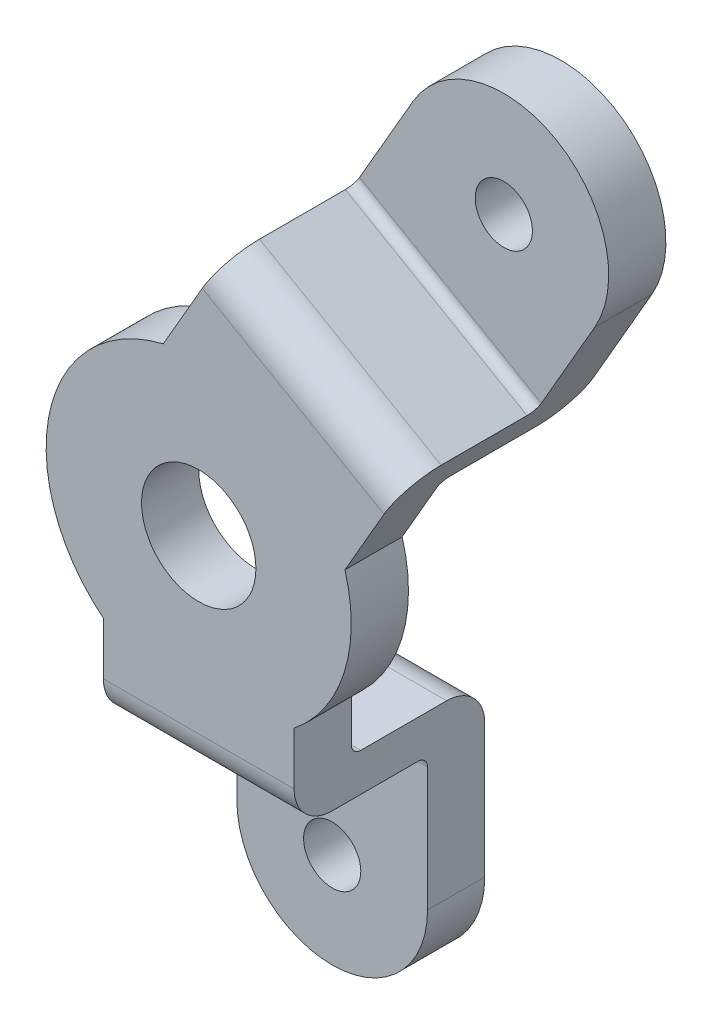
ISO-10303-21;
HEADER;
FILE_DESCRIPTION(('STEP AP214'),'2;1');
FILE_NAME('part.step','',(''),(''),'','','');
FILE_SCHEMA(('AUTOMOTIVE_DESIGN { 1 0 10303 214 1 1 1 1 }'));
ENDSEC;
DATA;
#1=APPLICATION_CONTEXT('core data for automotive mechanical design processes');
#2=APPLICATION_PROTOCOL_DEFINITION('international standard','automotive_design',2000,#1);
#3=PRODUCT_CONTEXT('',#1,'mechanical');
#4=PRODUCT('Part','Part','',(#3));
#5=PRODUCT_RELATED_PRODUCT_CATEGORY('part','',(#4));
#6=PRODUCT_DEFINITION_FORMATION('','',#4);
#7=PRODUCT_DEFINITION_CONTEXT('part definition',#1,'design');
#8=PRODUCT_DEFINITION('design','',#6,#7);
#9=PRODUCT_DEFINITION_SHAPE('','',#8);
#10=(LENGTH_UNIT() NAMED_UNIT(*) SI_UNIT(.MILLI.,.METRE.));
#11=(NAMED_UNIT(*) PLANE_ANGLE_UNIT() SI_UNIT($,.RADIAN.));
#12=(NAMED_UNIT(*) SI_UNIT($,.STERADIAN.) SOLID_ANGLE_UNIT());
#13=UNCERTAINTY_MEASURE_WITH_UNIT(LENGTH_MEASURE(1.E-05),#10,'distance_accuracy_value','');
#14=(GEOMETRIC_REPRESENTATION_CONTEXT(3) GLOBAL_UNCERTAINTY_ASSIGNED_CONTEXT((#13)) GLOBAL_UNIT_ASSIGNED_CONTEXT((#10,
#11,#12)) REPRESENTATION_CONTEXT('',''));
#15=CARTESIAN_POINT('',(0.,0.,0.));
#16=DIRECTION('',(0.,0.,1.));
#17=DIRECTION('',(1.,0.,0.));
#18=AXIS2_PLACEMENT_3D('',#15,#16,#17);
#19=CARTESIAN_POINT('',(17.9999999999998,31.1769145362399,0.));
#20=DIRECTION('',(0.,0.,1.));
#21=DIRECTION('',(1.,0.,0.));
#22=AXIS2_PLACEMENT_3D('',#19,#20,#21);
#23=PLANE('',#22);
#24=CARTESIAN_POINT('',(17.9999999999998,31.1769145362399,0.));
#25=DIRECTION('',(0.,0.,1.));
#26=DIRECTION('',(1.,0.,0.));
#27=AXIS2_PLACEMENT_3D('',#24,#25,#26);
#28=CIRCLE('',#27,3.);
#29=CARTESIAN_POINT('',(20.9999999999998,31.1769145362399,0.));
#30=VERTEX_POINT('',#29);
#31=EDGE_CURVE('E369',#30,#30,#28,.T.);
#32=ORIENTED_EDGE('',*,*,#31,.T.);
#33=EDGE_LOOP('',(#32));
#34=FACE_BOUND('',#33,.T.);
#35=DIRECTION('',(0.499999999999995,0.866025403784442,0.));
#36=VECTOR('',#35,1.);
#37=CARTESIAN_POINT('',(27.5262794416287,25.67691453624,0.));
#38=LINE('',#37,#36);
#39=CARTESIAN_POINT('',(21.4310169512842,15.1196102174944,0.));
#40=VERTEX_POINT('',#39);
#41=CARTESIAN_POINT('',(27.5262794416287,25.67691453624,0.));
#42=VERTEX_POINT('',#41);
#43=EDGE_CURVE('E388',#40,#42,#38,.T.);
#44=ORIENTED_EDGE('',*,*,#43,.F.);
#45=DIRECTION('',(0.866025403784439,-0.5,0.));
#46=VECTOR('',#45,1.);
#47=CARTESIAN_POINT('',(11.9047375096553,20.6196102174945,0.));
#48=LINE('',#47,#46);
#49=CARTESIAN_POINT('',(2.37845806802658,26.1196102174944,0.));
#50=VERTEX_POINT('',#49);
#51=EDGE_CURVE('E275',#40,#50,#48,.F.);
#52=ORIENTED_EDGE('',*,*,#51,.T.);
#53=DIRECTION('',(-0.499999999999995,-0.866025403784442,0.));
#54=VECTOR('',#53,1.);
#55=CARTESIAN_POINT('',(8.47372055837095,36.6769145362398,0.));
#56=LINE('',#55,#54);
#57=CARTESIAN_POINT('',(8.47372055837095,36.6769145362398,0.));
#58=VERTEX_POINT('',#57);
#59=EDGE_CURVE('E378',#58,#50,#56,.T.);
#60=ORIENTED_EDGE('',*,*,#59,.F.);
#61=CARTESIAN_POINT('',(17.9999999999998,31.1769145362399,0.));
#62=DIRECTION('',(0.,0.,1.));
#63=DIRECTION('',(1.,0.,0.));
#64=AXIS2_PLACEMENT_3D('',#61,#62,#63);
#65=CIRCLE('',#64,11.);
#66=EDGE_CURVE('E375',#42,#58,#65,.T.);
#67=ORIENTED_EDGE('',*,*,#66,.F.);
#68=EDGE_LOOP('',(#44,#52,#60,#67));
#69=FACE_BOUND('',#68,.T.);
#70=ADVANCED_FACE('F35',(#34,#69),#23,.F.);
#71=CARTESIAN_POINT('',(0.,0.,20.));
#72=DIRECTION('',(0.,0.,-1.));
#73=DIRECTION('',(-1.,0.,0.));
#74=AXIS2_PLACEMENT_3D('',#71,#72,#73);
#75=CYLINDRICAL_SURFACE('',#74,16.);
#76=CARTESIAN_POINT('',(0.,0.,14.));
#77=DIRECTION('',(0.,0.,-1.));
#78=DIRECTION('',(-1.,0.,0.));
#79=AXIS2_PLACEMENT_3D('',#76,#77,#78);
#80=CIRCLE('',#79,16.);
#81=CARTESIAN_POINT('',(-10.,-12.4899959967968,14.));
#82=VERTEX_POINT('',#81);
#83=CARTESIAN_POINT('',(-3.71680442231779,15.562305898749,14.));
#84=VERTEX_POINT('',#83);
#85=EDGE_CURVE('E423',#82,#84,#80,.T.);
#86=ORIENTED_EDGE('',*,*,#85,.F.);
#87=DIRECTION('',(0.,0.,-1.));
#88=VECTOR('',#87,1.);
#89=CARTESIAN_POINT('',(-10.,-12.4899959967968,20.));
#90=LINE('',#89,#88);
#91=CARTESIAN_POINT('',(-10.,-12.4899959967968,20.));
#92=VERTEX_POINT('',#91);
#93=EDGE_CURVE('E230',#92,#82,#90,.T.);
#94=ORIENTED_EDGE('',*,*,#93,.F.);
#95=CARTESIAN_POINT('',(0.,0.,20.));
#96=DIRECTION('',(0.,0.,1.));
#97=DIRECTION('',(1.,0.,0.));
#98=AXIS2_PLACEMENT_3D('',#95,#96,#97);
#99=CIRCLE('',#98,16.);
#100=CARTESIAN_POINT('',(-3.71680442231779,15.562305898749,20.));
#101=VERTEX_POINT('',#100);
#102=EDGE_CURVE('E392',#101,#92,#99,.T.);
#103=ORIENTED_EDGE('',*,*,#102,.F.);
#104=DIRECTION('',(0.,0.,-1.));
#105=VECTOR('',#104,1.);
#106=CARTESIAN_POINT('',(-3.71680442231779,15.562305898749,20.));
#107=LINE('',#106,#105);
#108=EDGE_CURVE('E233',#101,#84,#107,.T.);
#109=ORIENTED_EDGE('',*,*,#108,.T.);
#110=EDGE_LOOP('',(#86,#94,#103,#109));
#111=FACE_BOUND('',#110,.T.);
#112=ADVANCED_FACE('F422',(#111),#75,.T.);
#113=CARTESIAN_POINT('',(0.,0.,20.));
#114=DIRECTION('',(0.,0.,-1.));
#115=DIRECTION('',(-1.,0.,0.));
#116=AXIS2_PLACEMENT_3D('',#113,#114,#115);
#117=CYLINDRICAL_SURFACE('',#116,16.);
#118=CARTESIAN_POINT('',(0.,0.,14.));
#119=DIRECTION('',(0.,0.,-1.));
#120=DIRECTION('',(-1.,0.,0.));
#121=AXIS2_PLACEMENT_3D('',#118,#119,#120);
#122=CIRCLE('',#121,16.);
#123=CARTESIAN_POINT('',(15.3357544609399,4.56230589874916,14.));
#124=VERTEX_POINT('',#123);
#125=CARTESIAN_POINT('',(10.,-12.4899959967968,14.));
#126=VERTEX_POINT('',#125);
#127=EDGE_CURVE('E198',#124,#126,#122,.T.);
#128=ORIENTED_EDGE('',*,*,#127,.F.);
#129=DIRECTION('',(0.,0.,-1.));
#130=VECTOR('',#129,1.);
#131=CARTESIAN_POINT('',(15.3357544609399,4.56230589874916,20.));
#132=LINE('',#131,#130);
#133=CARTESIAN_POINT('',(15.3357544609399,4.56230589874916,20.));
#134=VERTEX_POINT('',#133);
#135=EDGE_CURVE('E209',#134,#124,#132,.T.);
#136=ORIENTED_EDGE('',*,*,#135,.F.);
#137=CARTESIAN_POINT('',(0.,0.,20.));
#138=DIRECTION('',(0.,0.,1.));
#139=DIRECTION('',(1.,0.,0.));
#140=AXIS2_PLACEMENT_3D('',#137,#138,#139);
#141=CIRCLE('',#140,16.);
#142=CARTESIAN_POINT('',(10.,-12.4899959967968,20.));
#143=VERTEX_POINT('',#142);
#144=EDGE_CURVE('E399',#143,#134,#141,.T.);
#145=ORIENTED_EDGE('',*,*,#144,.F.);
#146=DIRECTION('',(0.,0.,-1.));
#147=VECTOR('',#146,1.);
#148=CARTESIAN_POINT('',(10.,-12.4899959967968,20.));
#149=LINE('',#148,#147);
#150=EDGE_CURVE('E212',#143,#126,#149,.T.);
#151=ORIENTED_EDGE('',*,*,#150,.T.);
#152=EDGE_LOOP('',(#128,#136,#145,#151));
#153=FACE_BOUND('',#152,.T.);
#154=ADVANCED_FACE('F207',(#153),#117,.T.);
#155=CARTESIAN_POINT('',(0.,0.,20.));
#156=DIRECTION('',(0.,0.,-1.));
#157=DIRECTION('',(-1.,0.,0.));
#158=AXIS2_PLACEMENT_3D('',#155,#156,#157);
#159=CYLINDRICAL_SURFACE('',#158,6.);
#160=CARTESIAN_POINT('',(0.,0.,20.));
#161=DIRECTION('',(0.,0.,1.));
#162=DIRECTION('',(1.,0.,0.));
#163=AXIS2_PLACEMENT_3D('',#160,#161,#162);
#164=CIRCLE('',#163,6.);
#165=CARTESIAN_POINT('',(6.,0.,20.));
#166=VERTEX_POINT('',#165);
#167=EDGE_CURVE('E372',#166,#166,#164,.T.);
#168=ORIENTED_EDGE('',*,*,#167,.T.);
#169=EDGE_LOOP('',(#168));
#170=FACE_BOUND('',#169,.T.);
#171=CARTESIAN_POINT('',(0.,0.,14.));
#172=DIRECTION('',(0.,0.,-1.));
#173=DIRECTION('',(-1.,0.,0.));
#174=AXIS2_PLACEMENT_3D('',#171,#172,#173);
#175=CIRCLE('',#174,6.);
#176=CARTESIAN_POINT('',(-6.,0.,14.));
#177=VERTEX_POINT('',#176);
#178=EDGE_CURVE('E249',#177,#177,#175,.T.);
#179=ORIENTED_EDGE('',*,*,#178,.T.);
#180=EDGE_LOOP('',(#179));
#181=FACE_BOUND('',#180,.T.);
#182=ADVANCED_FACE('F496',(#170,#181),#159,.F.);
#183=CARTESIAN_POINT('',(0.,-36.,20.));
#184=DIRECTION('',(0.,0.,-1.));
#185=DIRECTION('',(-1.,0.,0.));
#186=AXIS2_PLACEMENT_3D('',#183,#184,#185);
#187=CYLINDRICAL_SURFACE('',#186,10.);
#188=CARTESIAN_POINT('',(0.,-36.,6.));
#189=DIRECTION('',(0.,0.,1.));
#190=DIRECTION('',(1.,0.,0.));
#191=AXIS2_PLACEMENT_3D('',#188,#189,#190);
#192=CIRCLE('',#191,10.);
#193=CARTESIAN_POINT('',(-10.,-36.,6.));
#194=VERTEX_POINT('',#193);
#195=CARTESIAN_POINT('',(10.,-36.,6.));
#196=VERTEX_POINT('',#195);
#197=EDGE_CURVE('E350',#194,#196,#192,.T.);
#198=ORIENTED_EDGE('',*,*,#197,.F.);
#199=DIRECTION('',(0.,0.,-1.));
#200=VECTOR('',#199,1.);
#201=CARTESIAN_POINT('',(-9.99999999999999,-36.,20.));
#202=LINE('',#201,#200);
#203=CARTESIAN_POINT('',(-9.99999999999999,-36.,0.));
#204=VERTEX_POINT('',#203);
#205=EDGE_CURVE('E227',#194,#204,#202,.T.);
#206=ORIENTED_EDGE('',*,*,#205,.T.);
#207=CARTESIAN_POINT('',(0.,-36.,0.));
#208=DIRECTION('',(0.,0.,1.));
#209=DIRECTION('',(1.,0.,0.));
#210=AXIS2_PLACEMENT_3D('',#207,#208,#209);
#211=CIRCLE('',#210,10.);
#212=CARTESIAN_POINT('',(10.,-36.,0.));
#213=VERTEX_POINT('',#212);
#214=EDGE_CURVE('E383',#204,#213,#211,.T.);
#215=ORIENTED_EDGE('',*,*,#214,.T.);
#216=DIRECTION('',(0.,0.,-1.));
#217=VECTOR('',#216,1.);
#218=CARTESIAN_POINT('',(10.,-36.,20.));
#219=LINE('',#218,#217);
#220=EDGE_CURVE('E220',#196,#213,#219,.T.);
#221=ORIENTED_EDGE('',*,*,#220,.F.);
#222=EDGE_LOOP('',(#198,#206,#215,#221));
#223=FACE_BOUND('',#222,.T.);
#224=ADVANCED_FACE('F448',(#223),#187,.T.);
#225=CARTESIAN_POINT('',(0.,-36.,20.));
#226=DIRECTION('',(0.,0.,-1.));
#227=DIRECTION('',(-1.,0.,0.));
#228=AXIS2_PLACEMENT_3D('',#225,#226,#227);
#229=CYLINDRICAL_SURFACE('',#228,3.);
#230=CARTESIAN_POINT('',(0.,-36.,0.));
#231=DIRECTION('',(0.,0.,1.));
#232=DIRECTION('',(1.,0.,0.));
#233=AXIS2_PLACEMENT_3D('',#230,#231,#232);
#234=CIRCLE('',#233,3.);
#235=CARTESIAN_POINT('',(3.00000000000001,-36.,0.));
#236=VERTEX_POINT('',#235);
#237=EDGE_CURVE('E242',#236,#236,#234,.T.);
#238=ORIENTED_EDGE('',*,*,#237,.F.);
#239=EDGE_LOOP('',(#238));
#240=FACE_BOUND('',#239,.T.);
#241=CARTESIAN_POINT('',(0.,-36.,6.));
#242=DIRECTION('',(0.,0.,1.));
#243=DIRECTION('',(1.,0.,0.));
#244=AXIS2_PLACEMENT_3D('',#241,#242,#243);
#245=CIRCLE('',#244,3.);
#246=CARTESIAN_POINT('',(3.00000000000001,-36.,6.));
#247=VERTEX_POINT('',#246);
#248=EDGE_CURVE('E244',#247,#247,#245,.T.);
#249=ORIENTED_EDGE('',*,*,#248,.T.);
#250=EDGE_LOOP('',(#249));
#251=FACE_BOUND('',#250,.T.);
#252=ADVANCED_FACE('F501',(#240,#251),#229,.F.);
#253=CARTESIAN_POINT('',(17.9999999999998,31.1769145362399,20.));
#254=DIRECTION('',(0.,0.,-1.));
#255=DIRECTION('',(-1.,0.,0.));
#256=AXIS2_PLACEMENT_3D('',#253,#254,#255);
#257=CYLINDRICAL_SURFACE('',#256,11.);
#258=CARTESIAN_POINT('',(17.9999999999998,31.1769145362399,6.));
#259=DIRECTION('',(0.,0.,1.));
#260=DIRECTION('',(1.,0.,0.));
#261=AXIS2_PLACEMENT_3D('',#258,#259,#260);
#262=CIRCLE('',#261,11.0000000000001);
#263=CARTESIAN_POINT('',(27.5262794416288,25.6769145362398,6.));
#264=VERTEX_POINT('',#263);
#265=CARTESIAN_POINT('',(8.47372055837089,36.6769145362399,6.));
#266=VERTEX_POINT('',#265);
#267=EDGE_CURVE('E362',#264,#266,#262,.T.);
#268=ORIENTED_EDGE('',*,*,#267,.F.);
#269=DIRECTION('',(0.,0.,-1.));
#270=VECTOR('',#269,1.);
#271=CARTESIAN_POINT('',(27.5262794416287,25.67691453624,20.));
#272=LINE('',#271,#270);
#273=EDGE_CURVE('E218',#264,#42,#272,.T.);
#274=ORIENTED_EDGE('',*,*,#273,.T.);
#275=ORIENTED_EDGE('',*,*,#66,.T.);
#276=DIRECTION('',(0.,0.,-1.));
#277=VECTOR('',#276,1.);
#278=CARTESIAN_POINT('',(8.47372055837095,36.6769145362398,20.));
#279=LINE('',#278,#277);
#280=EDGE_CURVE('E236',#266,#58,#279,.T.);
#281=ORIENTED_EDGE('',*,*,#280,.F.);
#282=EDGE_LOOP('',(#268,#274,#275,#281));
#283=FACE_BOUND('',#282,.T.);
#284=ADVANCED_FACE('F37',(#283),#257,.T.);
#285=CARTESIAN_POINT('',(17.9999999999998,31.1769145362399,20.));
#286=DIRECTION('',(0.,0.,-1.));
#287=DIRECTION('',(-1.,0.,0.));
#288=AXIS2_PLACEMENT_3D('',#285,#286,#287);
#289=CYLINDRICAL_SURFACE('',#288,3.);
#290=ORIENTED_EDGE('',*,*,#31,.F.);
#291=EDGE_LOOP('',(#290));
#292=FACE_BOUND('',#291,.T.);
#293=CARTESIAN_POINT('',(17.9999999999998,31.1769145362399,6.));
#294=DIRECTION('',(0.,0.,1.));
#295=DIRECTION('',(1.,0.,0.));
#296=AXIS2_PLACEMENT_3D('',#293,#294,#295);
#297=CIRCLE('',#296,3.);
#298=CARTESIAN_POINT('',(20.9999999999998,31.1769145362399,6.));
#299=VERTEX_POINT('',#298);
#300=EDGE_CURVE('E239',#299,#299,#297,.T.);
#301=ORIENTED_EDGE('',*,*,#300,.T.);
#302=EDGE_LOOP('',(#301));
#303=FACE_BOUND('',#302,.T.);
#304=ADVANCED_FACE('F484',(#292,#303),#289,.F.);
#305=CARTESIAN_POINT('',(17.9999999999998,31.1769145362399,20.));
#306=DIRECTION('',(0.,0.,1.));
#307=DIRECTION('',(1.,0.,0.));
#308=AXIS2_PLACEMENT_3D('',#305,#306,#307);
#309=PLANE('',#308);
#310=DIRECTION('',(0.,-1.,0.));
#311=VECTOR('',#310,1.);
#312=CARTESIAN_POINT('',(-9.99999999999999,-36.,20.));
#313=LINE('',#312,#311);
#314=CARTESIAN_POINT('',(-10.,-18.,20.));
#315=VERTEX_POINT('',#314);
#316=EDGE_CURVE('E394',#92,#315,#313,.T.);
#317=ORIENTED_EDGE('',*,*,#316,.T.);
#318=DIRECTION('',(-1.,0.,0.));
#319=VECTOR('',#318,1.);
#320=CARTESIAN_POINT('',(10.,-18.,20.));
#321=LINE('',#320,#319);
#322=CARTESIAN_POINT('',(10.,-18.,20.));
#323=VERTEX_POINT('',#322);
#324=EDGE_CURVE('E288',#315,#323,#321,.F.);
#325=ORIENTED_EDGE('',*,*,#324,.T.);
#326=DIRECTION('',(0.,1.,0.));
#327=VECTOR('',#326,1.);
#328=CARTESIAN_POINT('',(10.,-36.,20.));
#329=LINE('',#328,#327);
#330=EDGE_CURVE('E397',#323,#143,#329,.T.);
#331=ORIENTED_EDGE('',*,*,#330,.T.);
#332=ORIENTED_EDGE('',*,*,#144,.T.);
#333=DIRECTION('',(0.499999999999995,0.866025403784442,0.));
#334=VECTOR('',#333,1.);
#335=CARTESIAN_POINT('',(27.5262794416287,25.67691453624,20.));
#336=LINE('',#335,#334);
#337=CARTESIAN_POINT('',(19.4310169512842,11.6555086023567,20.));
#338=VERTEX_POINT('',#337);
#339=EDGE_CURVE('E217',#134,#338,#336,.T.);
#340=ORIENTED_EDGE('',*,*,#339,.T.);
#341=DIRECTION('',(0.866025403784439,-0.5,0.));
#342=VECTOR('',#341,1.);
#343=CARTESIAN_POINT('',(0.378458068026641,22.6555086023566,20.));
#344=LINE('',#343,#342);
#345=CARTESIAN_POINT('',(0.378458068026599,22.6555086023567,20.));
#346=VERTEX_POINT('',#345);
#347=EDGE_CURVE('E286',#338,#346,#344,.F.);
#348=ORIENTED_EDGE('',*,*,#347,.T.);
#349=DIRECTION('',(-0.499999999999995,-0.866025403784442,0.));
#350=VECTOR('',#349,1.);
#351=CARTESIAN_POINT('',(8.47372055837095,36.6769145362398,20.));
#352=LINE('',#351,#350);
#353=EDGE_CURVE('E390',#346,#101,#352,.T.);
#354=ORIENTED_EDGE('',*,*,#353,.T.);
#355=ORIENTED_EDGE('',*,*,#102,.T.);
#356=EDGE_LOOP('',(#317,#325,#331,#332,#340,#348,#354,#355));
#357=FACE_BOUND('',#356,.T.);
#358=ORIENTED_EDGE('',*,*,#167,.F.);
#359=EDGE_LOOP('',(#358));
#360=FACE_BOUND('',#359,.T.);
#361=ADVANCED_FACE('F402',(#357,#360),#309,.T.);
#362=DIRECTION('',(0.,-1.,0.));
#363=VECTOR('',#362,1.);
#364=CARTESIAN_POINT('',(-9.99999999999999,-36.,0.));
#365=LINE('',#364,#363);
#366=CARTESIAN_POINT('',(-10.,-22.,0.));
#367=VERTEX_POINT('',#366);
#368=EDGE_CURVE('E381',#367,#204,#365,.T.);
#369=ORIENTED_EDGE('',*,*,#368,.F.);
#370=DIRECTION('',(-1.,0.,0.));
#371=VECTOR('',#370,1.);
#372=CARTESIAN_POINT('',(17.9999999999998,-22.,0.));
#373=LINE('',#372,#371);
#374=CARTESIAN_POINT('',(10.,-22.,0.));
#375=VERTEX_POINT('',#374);
#376=EDGE_CURVE('E260',#367,#375,#373,.F.);
#377=ORIENTED_EDGE('',*,*,#376,.T.);
#378=DIRECTION('',(0.,1.,0.));
#379=VECTOR('',#378,1.);
#380=CARTESIAN_POINT('',(10.,-36.,0.));
#381=LINE('',#380,#379);
#382=EDGE_CURVE('E386',#213,#375,#381,.T.);
#383=ORIENTED_EDGE('',*,*,#382,.F.);
#384=ORIENTED_EDGE('',*,*,#214,.F.);
#385=EDGE_LOOP('',(#369,#377,#383,#384));
#386=FACE_BOUND('',#385,.T.);
#387=ORIENTED_EDGE('',*,*,#237,.T.);
#388=EDGE_LOOP('',(#387));
#389=FACE_BOUND('',#388,.T.);
#390=ADVANCED_FACE('F452',(#386,#389),#23,.F.);
#391=CARTESIAN_POINT('',(8.47372055837095,36.6769145362398,20.));
#392=DIRECTION('',(0.866025403784442,-0.499999999999995,0.));
#393=DIRECTION('',(0.499999999999995,0.866025403784442,0.));
#394=AXIS2_PLACEMENT_3D('',#391,#392,#393);
#395=PLANE('',#394);
#396=ORIENTED_EDGE('',*,*,#59,.T.);
#397=CARTESIAN_POINT('',(2.37845806802658,26.1196102174944,4.));
#398=DIRECTION('',(0.866025403784442,-0.499999999999995,0.));
#399=DIRECTION('',(0.499999999999995,0.866025403784442,0.));
#400=AXIS2_PLACEMENT_3D('',#397,#398,#399);
#401=CIRCLE('',#400,4.);
#402=CARTESIAN_POINT('',(0.378458068026602,22.6555086023567,4.));
#403=VERTEX_POINT('',#402);
#404=EDGE_CURVE('E280',#50,#403,#401,.F.);
#405=ORIENTED_EDGE('',*,*,#404,.T.);
#406=DIRECTION('',(0.,0.,-1.));
#407=VECTOR('',#406,1.);
#408=CARTESIAN_POINT('',(0.378458068026602,22.6555086023567,14.));
#409=LINE('',#408,#407);
#410=CARTESIAN_POINT('',(0.378458068026602,22.6555086023567,13.));
#411=VERTEX_POINT('',#410);
#412=EDGE_CURVE('E342',#411,#403,#409,.T.);
#413=ORIENTED_EDGE('',*,*,#412,.F.);
#414=CARTESIAN_POINT('',(-0.121541931973394,21.7894831985722,13.));
#415=DIRECTION('',(0.866025403784442,-0.499999999999995,0.));
#416=DIRECTION('',(0.499999999999995,0.866025403784442,0.));
#417=AXIS2_PLACEMENT_3D('',#414,#415,#416);
#418=CIRCLE('',#417,1.);
#419=CARTESIAN_POINT('',(-0.121541931973393,21.7894831985722,14.));
#420=VERTEX_POINT('',#419);
#421=EDGE_CURVE('E11',#411,#420,#418,.T.);
#422=ORIENTED_EDGE('',*,*,#421,.T.);
#423=DIRECTION('',(0.499999999999995,0.866025403784442,0.));
#424=VECTOR('',#423,1.);
#425=CARTESIAN_POINT('',(-3.71680442231779,15.562305898749,14.));
#426=LINE('',#425,#424);
#427=EDGE_CURVE('E345',#84,#420,#426,.T.);
#428=ORIENTED_EDGE('',*,*,#427,.F.);
#429=ORIENTED_EDGE('',*,*,#108,.F.);
#430=ORIENTED_EDGE('',*,*,#353,.F.);
#431=CARTESIAN_POINT('',(0.3784580680266,22.6555086023567,16.));
#432=DIRECTION('',(0.866025403784442,-0.499999999999995,0.));
#433=DIRECTION('',(0.499999999999995,0.866025403784442,0.));
#434=AXIS2_PLACEMENT_3D('',#431,#432,#433);
#435=CIRCLE('',#434,4.);
#436=CARTESIAN_POINT('',(2.37845806802664,26.1196102174944,16.));
#437=VERTEX_POINT('',#436);
#438=EDGE_CURVE('E277',#346,#437,#435,.F.);
#439=ORIENTED_EDGE('',*,*,#438,.T.);
#440=DIRECTION('',(0.,0.,1.));
#441=VECTOR('',#440,1.);
#442=CARTESIAN_POINT('',(2.37845806802664,26.1196102174944,6.));
#443=LINE('',#442,#441);
#444=CARTESIAN_POINT('',(2.37845806802664,26.1196102174944,7.));
#445=VERTEX_POINT('',#444);
#446=EDGE_CURVE('E364',#445,#437,#443,.T.);
#447=ORIENTED_EDGE('',*,*,#446,.F.);
#448=CARTESIAN_POINT('',(2.87845806802657,26.9856356212789,7.));
#449=DIRECTION('',(0.866025403784442,-0.499999999999995,0.));
#450=DIRECTION('',(0.499999999999995,0.866025403784442,0.));
#451=AXIS2_PLACEMENT_3D('',#448,#449,#450);
#452=CIRCLE('',#451,1.);
#453=CARTESIAN_POINT('',(2.87845806802663,26.9856356212788,6.));
#454=VERTEX_POINT('',#453);
#455=EDGE_CURVE('E309',#445,#454,#452,.T.);
#456=ORIENTED_EDGE('',*,*,#455,.T.);
#457=DIRECTION('',(-0.49999999999999,-0.866025403784445,0.));
#458=VECTOR('',#457,1.);
#459=CARTESIAN_POINT('',(2.37845806802664,26.1196102174944,6.));
#460=LINE('',#459,#458);
#461=EDGE_CURVE('E247',#266,#454,#460,.T.);
#462=ORIENTED_EDGE('',*,*,#461,.F.);
#463=ORIENTED_EDGE('',*,*,#280,.T.);
#464=EDGE_LOOP('',(#396,#405,#413,#422,#428,#429,#430,#439,#447,#456,#462,#463));
#465=FACE_BOUND('',#464,.T.);
#466=ADVANCED_FACE('F412',(#465),#395,.F.);
#467=CARTESIAN_POINT('',(-9.99999999999999,-36.,20.));
#468=DIRECTION('',(1.,0.,0.));
#469=DIRECTION('',(0.,1.,0.));
#470=AXIS2_PLACEMENT_3D('',#467,#468,#469);
#471=PLANE('',#470);
#472=DIRECTION('',(0.,1.,0.));
#473=VECTOR('',#472,1.);
#474=CARTESIAN_POINT('',(-10.,-18.,14.));
#475=LINE('',#474,#473);
#476=CARTESIAN_POINT('',(-10.,-17.,14.));
#477=VERTEX_POINT('',#476);
#478=EDGE_CURVE('E331',#477,#82,#475,.T.);
#479=ORIENTED_EDGE('',*,*,#478,.F.);
#480=CARTESIAN_POINT('',(-10.,-17.,13.));
#481=DIRECTION('',(1.,0.,0.));
#482=DIRECTION('',(0.,1.,0.));
#483=AXIS2_PLACEMENT_3D('',#480,#481,#482);
#484=CIRCLE('',#483,1.);
#485=CARTESIAN_POINT('',(-10.,-18.,13.));
#486=VERTEX_POINT('',#485);
#487=EDGE_CURVE('E316',#477,#486,#484,.T.);
#488=ORIENTED_EDGE('',*,*,#487,.T.);
#489=DIRECTION('',(0.,0.,-1.));
#490=VECTOR('',#489,1.);
#491=CARTESIAN_POINT('',(-10.,-18.,14.));
#492=LINE('',#491,#490);
#493=CARTESIAN_POINT('',(-10.,-18.,4.));
#494=VERTEX_POINT('',#493);
#495=EDGE_CURVE('E337',#486,#494,#492,.T.);
#496=ORIENTED_EDGE('',*,*,#495,.T.);
#497=CARTESIAN_POINT('',(-10.,-22.,4.));
#498=DIRECTION('',(1.,0.,0.));
#499=DIRECTION('',(0.,1.,0.));
#500=AXIS2_PLACEMENT_3D('',#497,#498,#499);
#501=CIRCLE('',#500,4.);
#502=EDGE_CURVE('E258',#494,#367,#501,.F.);
#503=ORIENTED_EDGE('',*,*,#502,.T.);
#504=ORIENTED_EDGE('',*,*,#368,.T.);
#505=ORIENTED_EDGE('',*,*,#205,.F.);
#506=DIRECTION('',(0.,-1.,0.));
#507=VECTOR('',#506,1.);
#508=CARTESIAN_POINT('',(-10.,-22.,6.));
#509=LINE('',#508,#507);
#510=CARTESIAN_POINT('',(-10.,-23.,6.));
#511=VERTEX_POINT('',#510);
#512=EDGE_CURVE('E252',#511,#194,#509,.T.);
#513=ORIENTED_EDGE('',*,*,#512,.F.);
#514=CARTESIAN_POINT('',(-10.,-23.,7.));
#515=DIRECTION('',(1.,0.,0.));
#516=DIRECTION('',(0.,1.,0.));
#517=AXIS2_PLACEMENT_3D('',#514,#515,#516);
#518=CIRCLE('',#517,1.);
#519=CARTESIAN_POINT('',(-10.,-22.,7.));
#520=VERTEX_POINT('',#519);
#521=EDGE_CURVE('E298',#511,#520,#518,.T.);
#522=ORIENTED_EDGE('',*,*,#521,.T.);
#523=DIRECTION('',(0.,0.,1.));
#524=VECTOR('',#523,1.);
#525=CARTESIAN_POINT('',(-10.,-22.,6.));
#526=LINE('',#525,#524);
#527=CARTESIAN_POINT('',(-10.,-22.,16.));
#528=VERTEX_POINT('',#527);
#529=EDGE_CURVE('E355',#520,#528,#526,.T.);
#530=ORIENTED_EDGE('',*,*,#529,.T.);
#531=CARTESIAN_POINT('',(-10.,-18.,16.));
#532=DIRECTION('',(1.,0.,0.));
#533=DIRECTION('',(0.,1.,0.));
#534=AXIS2_PLACEMENT_3D('',#531,#532,#533);
#535=CIRCLE('',#534,4.);
#536=EDGE_CURVE('E256',#528,#315,#535,.F.);
#537=ORIENTED_EDGE('',*,*,#536,.T.);
#538=ORIENTED_EDGE('',*,*,#316,.F.);
#539=ORIENTED_EDGE('',*,*,#93,.T.);
#540=EDGE_LOOP('',(#479,#488,#496,#503,#504,#505,#513,#522,#530,#537,#538,#539));
#541=FACE_BOUND('',#540,.T.);
#542=ADVANCED_FACE('F336',(#541),#471,.F.);
#543=CARTESIAN_POINT('',(10.,-36.,20.));
#544=DIRECTION('',(-1.,0.,0.));
#545=DIRECTION('',(0.,-1.,0.));
#546=AXIS2_PLACEMENT_3D('',#543,#544,#545);
#547=PLANE('',#546);
#548=ORIENTED_EDGE('',*,*,#382,.T.);
#549=CARTESIAN_POINT('',(10.,-22.,4.));
#550=DIRECTION('',(-1.,0.,0.));
#551=DIRECTION('',(0.,-1.,0.));
#552=AXIS2_PLACEMENT_3D('',#549,#550,#551);
#553=CIRCLE('',#552,4.);
#554=CARTESIAN_POINT('',(10.,-18.,4.));
#555=VERTEX_POINT('',#554);
#556=EDGE_CURVE('E265',#375,#555,#553,.F.);
#557=ORIENTED_EDGE('',*,*,#556,.T.);
#558=DIRECTION('',(0.,0.,-1.));
#559=VECTOR('',#558,1.);
#560=CARTESIAN_POINT('',(10.,-18.,14.));
#561=LINE('',#560,#559);
#562=CARTESIAN_POINT('',(10.,-18.,13.));
#563=VERTEX_POINT('',#562);
#564=EDGE_CURVE('E326',#563,#555,#561,.T.);
#565=ORIENTED_EDGE('',*,*,#564,.F.);
#566=CARTESIAN_POINT('',(10.,-17.,13.));
#567=DIRECTION('',(-1.,0.,0.));
#568=DIRECTION('',(0.,-1.,0.));
#569=AXIS2_PLACEMENT_3D('',#566,#567,#568);
#570=CIRCLE('',#569,1.);
#571=CARTESIAN_POINT('',(10.,-17.,14.));
#572=VERTEX_POINT('',#571);
#573=EDGE_CURVE('E318',#563,#572,#570,.T.);
#574=ORIENTED_EDGE('',*,*,#573,.T.);
#575=DIRECTION('',(0.,-1.,0.));
#576=VECTOR('',#575,1.);
#577=CARTESIAN_POINT('',(10.,-12.4899959967968,14.));
#578=LINE('',#577,#576);
#579=EDGE_CURVE('E213',#126,#572,#578,.T.);
#580=ORIENTED_EDGE('',*,*,#579,.F.);
#581=ORIENTED_EDGE('',*,*,#150,.F.);
#582=ORIENTED_EDGE('',*,*,#330,.F.);
#583=CARTESIAN_POINT('',(10.,-18.,16.));
#584=DIRECTION('',(-1.,0.,0.));
#585=DIRECTION('',(0.,-1.,0.));
#586=AXIS2_PLACEMENT_3D('',#583,#584,#585);
#587=CIRCLE('',#586,4.);
#588=CARTESIAN_POINT('',(10.,-22.,16.));
#589=VERTEX_POINT('',#588);
#590=EDGE_CURVE('E262',#323,#589,#587,.F.);
#591=ORIENTED_EDGE('',*,*,#590,.T.);
#592=DIRECTION('',(0.,0.,1.));
#593=VECTOR('',#592,1.);
#594=CARTESIAN_POINT('',(10.,-22.,6.));
#595=LINE('',#594,#593);
#596=CARTESIAN_POINT('',(10.,-22.,7.));
#597=VERTEX_POINT('',#596);
#598=EDGE_CURVE('E248',#597,#589,#595,.T.);
#599=ORIENTED_EDGE('',*,*,#598,.F.);
#600=CARTESIAN_POINT('',(10.,-23.,7.));
#601=DIRECTION('',(-1.,0.,0.));
#602=DIRECTION('',(0.,-1.,0.));
#603=AXIS2_PLACEMENT_3D('',#600,#601,#602);
#604=CIRCLE('',#603,1.);
#605=CARTESIAN_POINT('',(10.,-23.,6.));
#606=VERTEX_POINT('',#605);
#607=EDGE_CURVE('E300',#597,#606,#604,.T.);
#608=ORIENTED_EDGE('',*,*,#607,.T.);
#609=DIRECTION('',(0.,1.,0.));
#610=VECTOR('',#609,1.);
#611=CARTESIAN_POINT('',(10.,-22.,6.));
#612=LINE('',#611,#610);
#613=EDGE_CURVE('E352',#196,#606,#612,.T.);
#614=ORIENTED_EDGE('',*,*,#613,.F.);
#615=ORIENTED_EDGE('',*,*,#220,.T.);
#616=EDGE_LOOP('',(#548,#557,#565,#574,#580,#581,#582,#591,#599,#608,#614,#615));
#617=FACE_BOUND('',#616,.T.);
#618=ADVANCED_FACE('F325',(#617),#547,.F.);
#619=CARTESIAN_POINT('',(27.5262794416287,25.67691453624,20.));
#620=DIRECTION('',(-0.866025403784442,0.499999999999995,0.));
#621=DIRECTION('',(-0.499999999999995,-0.866025403784442,0.));
#622=AXIS2_PLACEMENT_3D('',#619,#620,#621);
#623=PLANE('',#622);
#624=DIRECTION('',(-0.499999999999984,-0.866025403784448,0.));
#625=VECTOR('',#624,1.);
#626=CARTESIAN_POINT('',(19.4310169512841,11.6555086023567,14.));
#627=LINE('',#626,#625);
#628=CARTESIAN_POINT('',(18.9310169512842,10.7894831985723,14.));
#629=VERTEX_POINT('',#628);
#630=EDGE_CURVE('E193',#629,#124,#627,.T.);
#631=ORIENTED_EDGE('',*,*,#630,.F.);
#632=CARTESIAN_POINT('',(18.9310169512842,10.7894831985722,13.));
#633=DIRECTION('',(-0.866025403784442,0.499999999999995,0.));
#634=DIRECTION('',(-0.499999999999995,-0.866025403784442,0.));
#635=AXIS2_PLACEMENT_3D('',#632,#633,#634);
#636=CIRCLE('',#635,1.);
#637=CARTESIAN_POINT('',(19.4310169512841,11.6555086023567,13.));
#638=VERTEX_POINT('',#637);
#639=EDGE_CURVE('E43',#629,#638,#636,.T.);
#640=ORIENTED_EDGE('',*,*,#639,.T.);
#641=DIRECTION('',(0.,0.,-1.));
#642=VECTOR('',#641,1.);
#643=CARTESIAN_POINT('',(19.4310169512841,11.6555086023567,14.));
#644=LINE('',#643,#642);
#645=CARTESIAN_POINT('',(19.4310169512841,11.6555086023567,4.));
#646=VERTEX_POINT('',#645);
#647=EDGE_CURVE('E253',#638,#646,#644,.T.);
#648=ORIENTED_EDGE('',*,*,#647,.T.);
#649=CARTESIAN_POINT('',(21.4310169512842,15.1196102174944,4.));
#650=DIRECTION('',(-0.866025403784442,0.499999999999995,0.));
#651=DIRECTION('',(-0.499999999999995,-0.866025403784442,0.));
#652=AXIS2_PLACEMENT_3D('',#649,#650,#651);
#653=CIRCLE('',#652,4.);
#654=EDGE_CURVE('E273',#646,#40,#653,.F.);
#655=ORIENTED_EDGE('',*,*,#654,.T.);
#656=ORIENTED_EDGE('',*,*,#43,.T.);
#657=ORIENTED_EDGE('',*,*,#273,.F.);
#658=DIRECTION('',(0.5,0.866025403784439,0.));
#659=VECTOR('',#658,1.);
#660=CARTESIAN_POINT('',(21.4310169512843,15.1196102174944,6.));
#661=LINE('',#660,#659);
#662=CARTESIAN_POINT('',(21.9310169512843,15.9856356212788,6.));
#663=VERTEX_POINT('',#662);
#664=EDGE_CURVE('E360',#663,#264,#661,.T.);
#665=ORIENTED_EDGE('',*,*,#664,.F.);
#666=CARTESIAN_POINT('',(21.9310169512842,15.9856356212789,7.));
#667=DIRECTION('',(-0.866025403784442,0.499999999999995,0.));
#668=DIRECTION('',(-0.499999999999995,-0.866025403784442,0.));
#669=AXIS2_PLACEMENT_3D('',#666,#667,#668);
#670=CIRCLE('',#669,1.);
#671=CARTESIAN_POINT('',(21.4310169512843,15.1196102174944,7.));
#672=VERTEX_POINT('',#671);
#673=EDGE_CURVE('E307',#663,#672,#670,.T.);
#674=ORIENTED_EDGE('',*,*,#673,.T.);
#675=DIRECTION('',(0.,0.,1.));
#676=VECTOR('',#675,1.);
#677=CARTESIAN_POINT('',(21.4310169512843,15.1196102174944,6.));
#678=LINE('',#677,#676);
#679=CARTESIAN_POINT('',(21.4310169512843,15.1196102174944,16.));
#680=VERTEX_POINT('',#679);
#681=EDGE_CURVE('E243',#672,#680,#678,.T.);
#682=ORIENTED_EDGE('',*,*,#681,.T.);
#683=CARTESIAN_POINT('',(19.4310169512842,11.6555086023567,16.));
#684=DIRECTION('',(-0.866025403784442,0.499999999999995,0.));
#685=DIRECTION('',(-0.499999999999995,-0.866025403784442,0.));
#686=AXIS2_PLACEMENT_3D('',#683,#684,#685);
#687=CIRCLE('',#686,4.);
#688=EDGE_CURVE('E271',#680,#338,#687,.F.);
#689=ORIENTED_EDGE('',*,*,#688,.T.);
#690=ORIENTED_EDGE('',*,*,#339,.F.);
#691=ORIENTED_EDGE('',*,*,#135,.T.);
#692=EDGE_LOOP('',(#631,#640,#648,#655,#656,#657,#665,#674,#682,#689,#690,#691));
#693=FACE_BOUND('',#692,.T.);
#694=ADVANCED_FACE('F215',(#693),#623,.F.);
#695=CARTESIAN_POINT('',(2.37845806802664,26.1196102174944,6.));
#696=DIRECTION('',(-0.5,-0.866025403784439,0.));
#697=DIRECTION('',(0.866025403784439,-0.5,0.));
#698=AXIS2_PLACEMENT_3D('',#695,#696,#697);
#699=PLANE('',#698);
#700=ORIENTED_EDGE('',*,*,#681,.F.);
#701=DIRECTION('',(0.866025403784439,-0.5,0.));
#702=VECTOR('',#701,1.);
#703=CARTESIAN_POINT('',(2.37845806802664,26.1196102174944,7.));
#704=LINE('',#703,#702);
#705=EDGE_CURVE('E305',#672,#445,#704,.F.);
#706=ORIENTED_EDGE('',*,*,#705,.T.);
#707=ORIENTED_EDGE('',*,*,#446,.T.);
#708=DIRECTION('',(0.866025403784439,-0.5,0.));
#709=VECTOR('',#708,1.);
#710=CARTESIAN_POINT('',(21.4310169512843,15.1196102174944,16.));
#711=LINE('',#710,#709);
#712=EDGE_CURVE('E290',#437,#680,#711,.T.);
#713=ORIENTED_EDGE('',*,*,#712,.T.);
#714=EDGE_LOOP('',(#700,#706,#707,#713));
#715=FACE_BOUND('',#714,.T.);
#716=ADVANCED_FACE('F493',(#715),#699,.F.);
#717=CARTESIAN_POINT('',(17.9999999999998,31.1769145362399,6.));
#718=DIRECTION('',(0.,0.,1.));
#719=DIRECTION('',(1.,0.,0.));
#720=AXIS2_PLACEMENT_3D('',#717,#718,#719);
#721=PLANE('',#720);
#722=ORIENTED_EDGE('',*,*,#300,.F.);
#723=EDGE_LOOP('',(#722));
#724=FACE_BOUND('',#723,.T.);
#725=ORIENTED_EDGE('',*,*,#461,.T.);
#726=DIRECTION('',(0.866025403784439,-0.5,0.));
#727=VECTOR('',#726,1.);
#728=CARTESIAN_POINT('',(12.4047375096553,21.4856356212789,6.));
#729=LINE('',#728,#727);
#730=EDGE_CURVE('E302',#454,#663,#729,.T.);
#731=ORIENTED_EDGE('',*,*,#730,.T.);
#732=ORIENTED_EDGE('',*,*,#664,.T.);
#733=ORIENTED_EDGE('',*,*,#267,.T.);
#734=EDGE_LOOP('',(#725,#731,#732,#733));
#735=FACE_BOUND('',#734,.T.);
#736=ADVANCED_FACE('F521',(#724,#735),#721,.T.);
#737=CARTESIAN_POINT('',(-10.,-22.,6.));
#738=DIRECTION('',(0.,1.,0.));
#739=DIRECTION('',(0.,0.,1.));
#740=AXIS2_PLACEMENT_3D('',#737,#738,#739);
#741=PLANE('',#740);
#742=ORIENTED_EDGE('',*,*,#529,.F.);
#743=DIRECTION('',(-1.,0.,0.));
#744=VECTOR('',#743,1.);
#745=CARTESIAN_POINT('',(-10.,-22.,7.));
#746=LINE('',#745,#744);
#747=EDGE_CURVE('E296',#520,#597,#746,.F.);
#748=ORIENTED_EDGE('',*,*,#747,.T.);
#749=ORIENTED_EDGE('',*,*,#598,.T.);
#750=DIRECTION('',(-1.,0.,0.));
#751=VECTOR('',#750,1.);
#752=CARTESIAN_POINT('',(-10.,-22.,16.));
#753=LINE('',#752,#751);
#754=EDGE_CURVE('E283',#589,#528,#753,.T.);
#755=ORIENTED_EDGE('',*,*,#754,.T.);
#756=EDGE_LOOP('',(#742,#748,#749,#755));
#757=FACE_BOUND('',#756,.T.);
#758=ADVANCED_FACE('F431',(#757),#741,.F.);
#759=CARTESIAN_POINT('',(0.,-36.,6.));
#760=DIRECTION('',(0.,0.,1.));
#761=DIRECTION('',(1.,0.,0.));
#762=AXIS2_PLACEMENT_3D('',#759,#760,#761);
#763=PLANE('',#762);
#764=ORIENTED_EDGE('',*,*,#248,.F.);
#765=EDGE_LOOP('',(#764));
#766=FACE_BOUND('',#765,.T.);
#767=ORIENTED_EDGE('',*,*,#613,.T.);
#768=DIRECTION('',(-1.,0.,0.));
#769=VECTOR('',#768,1.);
#770=CARTESIAN_POINT('',(0.,-23.,6.));
#771=LINE('',#770,#769);
#772=EDGE_CURVE('E293',#606,#511,#771,.T.);
#773=ORIENTED_EDGE('',*,*,#772,.T.);
#774=ORIENTED_EDGE('',*,*,#512,.T.);
#775=ORIENTED_EDGE('',*,*,#197,.T.);
#776=EDGE_LOOP('',(#767,#773,#774,#775));
#777=FACE_BOUND('',#776,.T.);
#778=ADVANCED_FACE('F442',(#766,#777),#763,.T.);
#779=CARTESIAN_POINT('',(19.4310169512841,11.6555086023567,14.));
#780=DIRECTION('',(0.5,0.866025403784439,0.));
#781=DIRECTION('',(-0.866025403784439,0.5,0.));
#782=AXIS2_PLACEMENT_3D('',#779,#780,#781);
#783=PLANE('',#782);
#784=ORIENTED_EDGE('',*,*,#647,.F.);
#785=DIRECTION('',(0.866025403784439,-0.5,0.));
#786=VECTOR('',#785,1.);
#787=CARTESIAN_POINT('',(19.4310169512841,11.6555086023567,13.));
#788=LINE('',#787,#786);
#789=EDGE_CURVE('E56',#638,#411,#788,.F.);
#790=ORIENTED_EDGE('',*,*,#789,.T.);
#791=ORIENTED_EDGE('',*,*,#412,.T.);
#792=DIRECTION('',(0.866025403784439,-0.5,0.));
#793=VECTOR('',#792,1.);
#794=CARTESIAN_POINT('',(19.4310169512841,11.6555086023567,4.));
#795=LINE('',#794,#793);
#796=EDGE_CURVE('E268',#403,#646,#795,.T.);
#797=ORIENTED_EDGE('',*,*,#796,.T.);
#798=EDGE_LOOP('',(#784,#790,#791,#797));
#799=FACE_BOUND('',#798,.T.);
#800=ADVANCED_FACE('F542',(#799),#783,.F.);
#801=CARTESIAN_POINT('',(10.,-18.,14.));
#802=DIRECTION('',(0.,-1.,0.));
#803=DIRECTION('',(0.,0.,-1.));
#804=AXIS2_PLACEMENT_3D('',#801,#802,#803);
#805=PLANE('',#804);
#806=ORIENTED_EDGE('',*,*,#495,.F.);
#807=DIRECTION('',(-1.,0.,0.));
#808=VECTOR('',#807,1.);
#809=CARTESIAN_POINT('',(10.,-18.,13.));
#810=LINE('',#809,#808);
#811=EDGE_CURVE('E314',#486,#563,#810,.F.);
#812=ORIENTED_EDGE('',*,*,#811,.T.);
#813=ORIENTED_EDGE('',*,*,#564,.T.);
#814=DIRECTION('',(-1.,0.,0.));
#815=VECTOR('',#814,1.);
#816=CARTESIAN_POINT('',(10.,-18.,4.));
#817=LINE('',#816,#815);
#818=EDGE_CURVE('E238',#555,#494,#817,.T.);
#819=ORIENTED_EDGE('',*,*,#818,.T.);
#820=EDGE_LOOP('',(#806,#812,#813,#819));
#821=FACE_BOUND('',#820,.T.);
#822=ADVANCED_FACE('F340',(#821),#805,.F.);
#823=CARTESIAN_POINT('',(0.,0.,14.));
#824=DIRECTION('',(0.,0.,-1.));
#825=DIRECTION('',(-1.,0.,0.));
#826=AXIS2_PLACEMENT_3D('',#823,#824,#825);
#827=PLANE('',#826);
#828=ORIENTED_EDGE('',*,*,#178,.F.);
#829=EDGE_LOOP('',(#828));
#830=FACE_BOUND('',#829,.T.);
#831=ORIENTED_EDGE('',*,*,#427,.T.);
#832=DIRECTION('',(0.866025403784439,-0.5,0.));
#833=VECTOR('',#832,1.);
#834=CARTESIAN_POINT('',(9.40473750965553,16.2894831985722,14.));
#835=LINE('',#834,#833);
#836=EDGE_CURVE('E201',#420,#629,#835,.T.);
#837=ORIENTED_EDGE('',*,*,#836,.T.);
#838=ORIENTED_EDGE('',*,*,#630,.T.);
#839=ORIENTED_EDGE('',*,*,#127,.T.);
#840=ORIENTED_EDGE('',*,*,#579,.T.);
#841=DIRECTION('',(-1.,0.,0.));
#842=VECTOR('',#841,1.);
#843=CARTESIAN_POINT('',(0.,-17.,14.));
#844=LINE('',#843,#842);
#845=EDGE_CURVE('E311',#572,#477,#844,.T.);
#846=ORIENTED_EDGE('',*,*,#845,.T.);
#847=ORIENTED_EDGE('',*,*,#478,.T.);
#848=ORIENTED_EDGE('',*,*,#85,.T.);
#849=EDGE_LOOP('',(#831,#837,#838,#839,#840,#846,#847,#848));
#850=FACE_BOUND('',#849,.T.);
#851=ADVANCED_FACE('F196',(#830,#850),#827,.T.);
#852=CARTESIAN_POINT('',(10.,-22.,4.));
#853=DIRECTION('',(-1.,0.,0.));
#854=DIRECTION('',(0.,0.,1.));
#855=AXIS2_PLACEMENT_3D('',#852,#853,#854);
#856=CYLINDRICAL_SURFACE('',#855,4.);
#857=ORIENTED_EDGE('',*,*,#556,.F.);
#858=ORIENTED_EDGE('',*,*,#376,.F.);
#859=ORIENTED_EDGE('',*,*,#502,.F.);
#860=ORIENTED_EDGE('',*,*,#818,.F.);
#861=EDGE_LOOP('',(#857,#858,#859,#860));
#862=FACE_BOUND('',#861,.T.);
#863=ADVANCED_FACE('F457',(#862),#856,.T.);
#864=CARTESIAN_POINT('',(21.4310169512842,15.1196102174945,4.));
#865=DIRECTION('',(0.866025403784439,-0.5,0.));
#866=DIRECTION('',(0.5,0.866025403784439,0.));
#867=AXIS2_PLACEMENT_3D('',#864,#865,#866);
#868=CYLINDRICAL_SURFACE('',#867,4.);
#869=ORIENTED_EDGE('',*,*,#404,.F.);
#870=ORIENTED_EDGE('',*,*,#51,.F.);
#871=ORIENTED_EDGE('',*,*,#654,.F.);
#872=ORIENTED_EDGE('',*,*,#796,.F.);
#873=EDGE_LOOP('',(#869,#870,#871,#872));
#874=FACE_BOUND('',#873,.T.);
#875=ADVANCED_FACE('F459',(#874),#868,.T.);
#876=CARTESIAN_POINT('',(-10.,-18.,16.));
#877=DIRECTION('',(1.,0.,0.));
#878=DIRECTION('',(0.,0.,-1.));
#879=AXIS2_PLACEMENT_3D('',#876,#877,#878);
#880=CYLINDRICAL_SURFACE('',#879,4.);
#881=ORIENTED_EDGE('',*,*,#590,.F.);
#882=ORIENTED_EDGE('',*,*,#324,.F.);
#883=ORIENTED_EDGE('',*,*,#536,.F.);
#884=ORIENTED_EDGE('',*,*,#754,.F.);
#885=EDGE_LOOP('',(#881,#882,#883,#884));
#886=FACE_BOUND('',#885,.T.);
#887=ADVANCED_FACE('F429',(#886),#880,.T.);
#888=CARTESIAN_POINT('',(0.378458068026641,22.6555086023566,16.));
#889=DIRECTION('',(-0.866025403784439,0.5,0.));
#890=DIRECTION('',(-0.5,-0.866025403784439,0.));
#891=AXIS2_PLACEMENT_3D('',#888,#889,#890);
#892=CYLINDRICAL_SURFACE('',#891,4.);
#893=ORIENTED_EDGE('',*,*,#438,.F.);
#894=ORIENTED_EDGE('',*,*,#347,.F.);
#895=ORIENTED_EDGE('',*,*,#688,.F.);
#896=ORIENTED_EDGE('',*,*,#712,.F.);
#897=EDGE_LOOP('',(#893,#894,#895,#896));
#898=FACE_BOUND('',#897,.T.);
#899=ADVANCED_FACE('F408',(#898),#892,.T.);
#900=CARTESIAN_POINT('',(0.,-23.,7.));
#901=DIRECTION('',(-1.,0.,0.));
#902=DIRECTION('',(0.,0.,1.));
#903=AXIS2_PLACEMENT_3D('',#900,#901,#902);
#904=CYLINDRICAL_SURFACE('',#903,1.);
#905=ORIENTED_EDGE('',*,*,#607,.F.);
#906=ORIENTED_EDGE('',*,*,#747,.F.);
#907=ORIENTED_EDGE('',*,*,#521,.F.);
#908=ORIENTED_EDGE('',*,*,#772,.F.);
#909=EDGE_LOOP('',(#905,#906,#907,#908));
#910=FACE_BOUND('',#909,.T.);
#911=ADVANCED_FACE('F439',(#910),#904,.F.);
#912=CARTESIAN_POINT('',(12.4047375096553,21.4856356212789,7.));
#913=DIRECTION('',(0.866025403784439,-0.5,0.));
#914=DIRECTION('',(0.5,0.866025403784439,0.));
#915=AXIS2_PLACEMENT_3D('',#912,#913,#914);
#916=CYLINDRICAL_SURFACE('',#915,1.);
#917=ORIENTED_EDGE('',*,*,#455,.F.);
#918=ORIENTED_EDGE('',*,*,#705,.F.);
#919=ORIENTED_EDGE('',*,*,#673,.F.);
#920=ORIENTED_EDGE('',*,*,#730,.F.);
#921=EDGE_LOOP('',(#917,#918,#919,#920));
#922=FACE_BOUND('',#921,.T.);
#923=ADVANCED_FACE('F595',(#922),#916,.F.);
#924=CARTESIAN_POINT('',(0.,-17.,13.));
#925=DIRECTION('',(-1.,0.,0.));
#926=DIRECTION('',(0.,0.,1.));
#927=AXIS2_PLACEMENT_3D('',#924,#925,#926);
#928=CYLINDRICAL_SURFACE('',#927,1.);
#929=ORIENTED_EDGE('',*,*,#573,.F.);
#930=ORIENTED_EDGE('',*,*,#811,.F.);
#931=ORIENTED_EDGE('',*,*,#487,.F.);
#932=ORIENTED_EDGE('',*,*,#845,.F.);
#933=EDGE_LOOP('',(#929,#930,#931,#932));
#934=FACE_BOUND('',#933,.T.);
#935=ADVANCED_FACE('F333',(#934),#928,.F.);
#936=CARTESIAN_POINT('',(9.40473750965553,16.2894831985722,13.));
#937=DIRECTION('',(0.866025403784439,-0.5,0.));
#938=DIRECTION('',(0.5,0.866025403784439,0.));
#939=AXIS2_PLACEMENT_3D('',#936,#937,#938);
#940=CYLINDRICAL_SURFACE('',#939,1.);
#941=ORIENTED_EDGE('',*,*,#421,.F.);
#942=ORIENTED_EDGE('',*,*,#789,.F.);
#943=ORIENTED_EDGE('',*,*,#639,.F.);
#944=ORIENTED_EDGE('',*,*,#836,.F.);
#945=EDGE_LOOP('',(#941,#942,#943,#944));
#946=FACE_BOUND('',#945,.T.);
#947=ADVANCED_FACE('F613',(#946),#940,.F.);
#948=CLOSED_SHELL('',(#70,#112,#154,#182,#224,#252,#284,#304,#361,#390,#466,#542,#618,#694,#716,
#736,#758,#778,#800,#822,#851,#863,#875,#887,#899,#911,#923,#935,#947));
#949=MANIFOLD_SOLID_BREP('B2',#948);
#950=ADVANCED_BREP_SHAPE_REPRESENTATION('',(#18,#949),#14);
#951=SHAPE_DEFINITION_REPRESENTATION(#9,#950);
ENDSEC;
END-ISO-10303-21;
